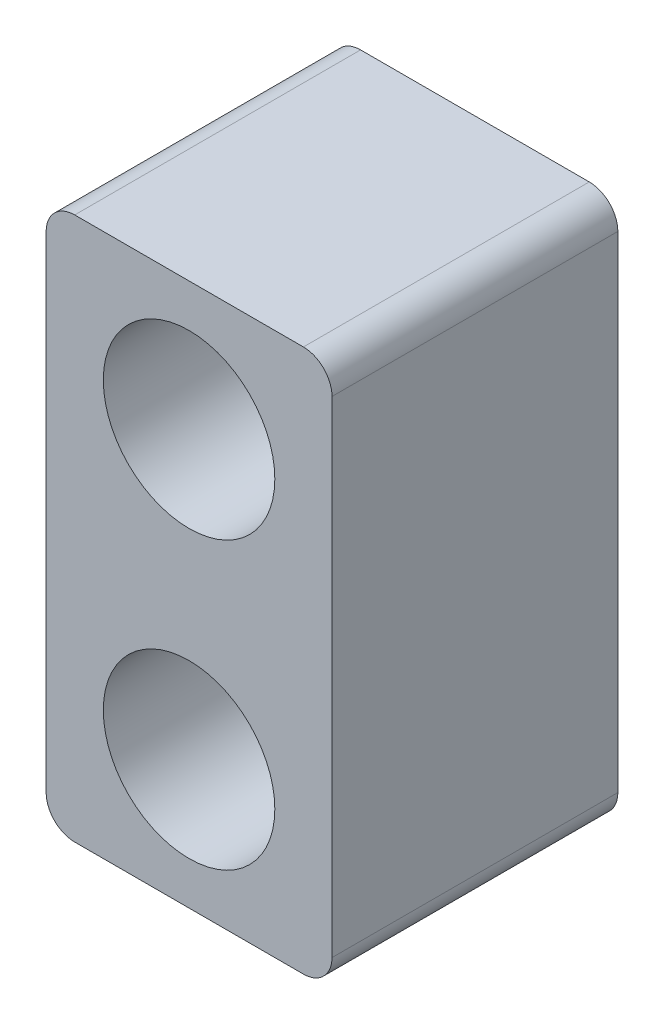
ISO-10303-21;
HEADER;
FILE_DESCRIPTION(('STEP AP214'),'2;1');
FILE_NAME('part.step','',(''),(''),'','','');
FILE_SCHEMA(('AUTOMOTIVE_DESIGN { 1 0 10303 214 1 1 1 1 }'));
ENDSEC;
DATA;
#1=APPLICATION_CONTEXT('core data for automotive mechanical design processes');
#2=APPLICATION_PROTOCOL_DEFINITION('international standard','automotive_design',2000,#1);
#3=PRODUCT_CONTEXT('',#1,'mechanical');
#4=PRODUCT('Part','Part','',(#3));
#5=PRODUCT_RELATED_PRODUCT_CATEGORY('part','',(#4));
#6=PRODUCT_DEFINITION_FORMATION('','',#4);
#7=PRODUCT_DEFINITION_CONTEXT('part definition',#1,'design');
#8=PRODUCT_DEFINITION('design','',#6,#7);
#9=PRODUCT_DEFINITION_SHAPE('','',#8);
#10=(LENGTH_UNIT() NAMED_UNIT(*) SI_UNIT(.MILLI.,.METRE.));
#11=(NAMED_UNIT(*) PLANE_ANGLE_UNIT() SI_UNIT($,.RADIAN.));
#12=(NAMED_UNIT(*) SI_UNIT($,.STERADIAN.) SOLID_ANGLE_UNIT());
#13=UNCERTAINTY_MEASURE_WITH_UNIT(LENGTH_MEASURE(1.E-05),#10,'distance_accuracy_value','');
#14=(GEOMETRIC_REPRESENTATION_CONTEXT(3) GLOBAL_UNCERTAINTY_ASSIGNED_CONTEXT((#13)) GLOBAL_UNIT_ASSIGNED_CONTEXT((#10,
#11,#12)) REPRESENTATION_CONTEXT('',''));
#15=CARTESIAN_POINT('',(0.,0.,0.));
#16=DIRECTION('',(0.,0.,1.));
#17=DIRECTION('',(1.,0.,0.));
#18=AXIS2_PLACEMENT_3D('',#15,#16,#17);
#19=CARTESIAN_POINT('',(10.,-19.,20.));
#20=DIRECTION('',(-1.,0.,0.));
#21=DIRECTION('',(0.,0.,1.));
#22=AXIS2_PLACEMENT_3D('',#19,#20,#21);
#23=PLANE('',#22);
#24=DIRECTION('',(0.,1.,0.));
#25=VECTOR('',#24,1.);
#26=CARTESIAN_POINT('',(10.,-19.,20.));
#27=LINE('',#26,#25);
#28=CARTESIAN_POINT('',(10.,-17.,20.));
#29=VERTEX_POINT('',#28);
#30=CARTESIAN_POINT('',(10.,17.,20.));
#31=VERTEX_POINT('',#30);
#32=EDGE_CURVE('E108',#29,#31,#27,.T.);
#33=ORIENTED_EDGE('',*,*,#32,.F.);
#34=DIRECTION('',(0.,0.,-1.));
#35=VECTOR('',#34,1.);
#36=CARTESIAN_POINT('',(10.,-17.,20.));
#37=LINE('',#36,#35);
#38=CARTESIAN_POINT('',(10.,-17.,0.));
#39=VERTEX_POINT('',#38);
#40=EDGE_CURVE('E151',#29,#39,#37,.T.);
#41=ORIENTED_EDGE('',*,*,#40,.T.);
#42=DIRECTION('',(0.,1.,0.));
#43=VECTOR('',#42,1.);
#44=CARTESIAN_POINT('',(10.,-19.,0.));
#45=LINE('',#44,#43);
#46=CARTESIAN_POINT('',(10.,17.,0.));
#47=VERTEX_POINT('',#46);
#48=EDGE_CURVE('E122',#39,#47,#45,.T.);
#49=ORIENTED_EDGE('',*,*,#48,.T.);
#50=DIRECTION('',(0.,0.,-1.));
#51=VECTOR('',#50,1.);
#52=CARTESIAN_POINT('',(10.,17.,20.));
#53=LINE('',#52,#51);
#54=EDGE_CURVE('E149',#47,#31,#53,.F.);
#55=ORIENTED_EDGE('',*,*,#54,.T.);
#56=EDGE_LOOP('',(#33,#41,#49,#55));
#57=FACE_BOUND('',#56,.T.);
#58=ADVANCED_FACE('F17',(#57),#23,.F.);
#59=CARTESIAN_POINT('',(-10.,19.,20.));
#60=DIRECTION('',(0.,-1.,0.));
#61=DIRECTION('',(0.,0.,-1.));
#62=AXIS2_PLACEMENT_3D('',#59,#60,#61);
#63=PLANE('',#62);
#64=DIRECTION('',(-1.,0.,0.));
#65=VECTOR('',#64,1.);
#66=CARTESIAN_POINT('',(-10.,19.,20.));
#67=LINE('',#66,#65);
#68=CARTESIAN_POINT('',(8.,19.,20.));
#69=VERTEX_POINT('',#68);
#70=CARTESIAN_POINT('',(-8.,19.,20.));
#71=VERTEX_POINT('',#70);
#72=EDGE_CURVE('E115',#69,#71,#67,.T.);
#73=ORIENTED_EDGE('',*,*,#72,.F.);
#74=DIRECTION('',(0.,0.,-1.));
#75=VECTOR('',#74,1.);
#76=CARTESIAN_POINT('',(8.,19.,20.));
#77=LINE('',#76,#75);
#78=CARTESIAN_POINT('',(8.,19.,0.));
#79=VERTEX_POINT('',#78);
#80=EDGE_CURVE('E11',#69,#79,#77,.T.);
#81=ORIENTED_EDGE('',*,*,#80,.T.);
#82=DIRECTION('',(-1.,0.,0.));
#83=VECTOR('',#82,1.);
#84=CARTESIAN_POINT('',(-10.,19.,0.));
#85=LINE('',#84,#83);
#86=CARTESIAN_POINT('',(-8.,19.,0.));
#87=VERTEX_POINT('',#86);
#88=EDGE_CURVE('E111',#79,#87,#85,.T.);
#89=ORIENTED_EDGE('',*,*,#88,.T.);
#90=DIRECTION('',(0.,0.,-1.));
#91=VECTOR('',#90,1.);
#92=CARTESIAN_POINT('',(-8.,19.,20.));
#93=LINE('',#92,#91);
#94=EDGE_CURVE('E25',#87,#71,#93,.F.);
#95=ORIENTED_EDGE('',*,*,#94,.T.);
#96=EDGE_LOOP('',(#73,#81,#89,#95));
#97=FACE_BOUND('',#96,.T.);
#98=ADVANCED_FACE('F211',(#97),#63,.F.);
#99=CARTESIAN_POINT('',(-10.,-19.,20.));
#100=DIRECTION('',(1.,0.,0.));
#101=DIRECTION('',(0.,0.,-1.));
#102=AXIS2_PLACEMENT_3D('',#99,#100,#101);
#103=PLANE('',#102);
#104=DIRECTION('',(0.,-1.,0.));
#105=VECTOR('',#104,1.);
#106=CARTESIAN_POINT('',(-10.,-19.,0.));
#107=LINE('',#106,#105);
#108=CARTESIAN_POINT('',(-10.,17.,0.));
#109=VERTEX_POINT('',#108);
#110=CARTESIAN_POINT('',(-10.,-17.,0.));
#111=VERTEX_POINT('',#110);
#112=EDGE_CURVE('E109',#109,#111,#107,.T.);
#113=ORIENTED_EDGE('',*,*,#112,.T.);
#114=DIRECTION('',(0.,0.,-1.));
#115=VECTOR('',#114,1.);
#116=CARTESIAN_POINT('',(-10.,-17.,20.));
#117=LINE('',#116,#115);
#118=CARTESIAN_POINT('',(-10.,-17.,20.));
#119=VERTEX_POINT('',#118);
#120=EDGE_CURVE('E86',#111,#119,#117,.F.);
#121=ORIENTED_EDGE('',*,*,#120,.T.);
#122=DIRECTION('',(0.,-1.,0.));
#123=VECTOR('',#122,1.);
#124=CARTESIAN_POINT('',(-10.,-19.,20.));
#125=LINE('',#124,#123);
#126=CARTESIAN_POINT('',(-10.,17.,20.));
#127=VERTEX_POINT('',#126);
#128=EDGE_CURVE('E163',#127,#119,#125,.T.);
#129=ORIENTED_EDGE('',*,*,#128,.F.);
#130=DIRECTION('',(0.,0.,-1.));
#131=VECTOR('',#130,1.);
#132=CARTESIAN_POINT('',(-10.,17.,20.));
#133=LINE('',#132,#131);
#134=EDGE_CURVE('E91',#127,#109,#133,.T.);
#135=ORIENTED_EDGE('',*,*,#134,.T.);
#136=EDGE_LOOP('',(#113,#121,#129,#135));
#137=FACE_BOUND('',#136,.T.);
#138=ADVANCED_FACE('F220',(#137),#103,.F.);
#139=CARTESIAN_POINT('',(-10.,-19.,20.));
#140=DIRECTION('',(0.,1.,0.));
#141=DIRECTION('',(0.,0.,1.));
#142=AXIS2_PLACEMENT_3D('',#139,#140,#141);
#143=PLANE('',#142);
#144=DIRECTION('',(1.,0.,0.));
#145=VECTOR('',#144,1.);
#146=CARTESIAN_POINT('',(-10.,-19.,20.));
#147=LINE('',#146,#145);
#148=CARTESIAN_POINT('',(-8.,-19.,20.));
#149=VERTEX_POINT('',#148);
#150=CARTESIAN_POINT('',(8.,-19.,20.));
#151=VERTEX_POINT('',#150);
#152=EDGE_CURVE('E103',#149,#151,#147,.T.);
#153=ORIENTED_EDGE('',*,*,#152,.F.);
#154=DIRECTION('',(0.,0.,-1.));
#155=VECTOR('',#154,1.);
#156=CARTESIAN_POINT('',(-8.,-19.,20.));
#157=LINE('',#156,#155);
#158=CARTESIAN_POINT('',(-8.,-19.,0.));
#159=VERTEX_POINT('',#158);
#160=EDGE_CURVE('E87',#149,#159,#157,.T.);
#161=ORIENTED_EDGE('',*,*,#160,.T.);
#162=DIRECTION('',(1.,0.,0.));
#163=VECTOR('',#162,1.);
#164=CARTESIAN_POINT('',(-10.,-19.,0.));
#165=LINE('',#164,#163);
#166=CARTESIAN_POINT('',(8.,-19.,0.));
#167=VERTEX_POINT('',#166);
#168=EDGE_CURVE('E99',#159,#167,#165,.T.);
#169=ORIENTED_EDGE('',*,*,#168,.T.);
#170=DIRECTION('',(0.,0.,-1.));
#171=VECTOR('',#170,1.);
#172=CARTESIAN_POINT('',(8.,-19.,20.));
#173=LINE('',#172,#171);
#174=EDGE_CURVE('E104',#167,#151,#173,.F.);
#175=ORIENTED_EDGE('',*,*,#174,.T.);
#176=EDGE_LOOP('',(#153,#161,#169,#175));
#177=FACE_BOUND('',#176,.T.);
#178=ADVANCED_FACE('F97',(#177),#143,.F.);
#179=CARTESIAN_POINT('',(0.,0.,20.));
#180=DIRECTION('',(0.,0.,-1.));
#181=DIRECTION('',(-1.,0.,0.));
#182=AXIS2_PLACEMENT_3D('',#179,#180,#181);
#183=PLANE('',#182);
#184=CARTESIAN_POINT('',(0.,-10.,20.));
#185=DIRECTION('',(0.,0.,-1.));
#186=DIRECTION('',(-1.,0.,0.));
#187=AXIS2_PLACEMENT_3D('',#184,#185,#186);
#188=CIRCLE('',#187,6.);
#189=CARTESIAN_POINT('',(-6.,-10.,20.));
#190=VERTEX_POINT('',#189);
#191=EDGE_CURVE('E172',#190,#190,#188,.T.);
#192=ORIENTED_EDGE('',*,*,#191,.T.);
#193=EDGE_LOOP('',(#192));
#194=FACE_BOUND('',#193,.T.);
#195=CARTESIAN_POINT('',(0.,10.,20.));
#196=DIRECTION('',(0.,0.,-1.));
#197=DIRECTION('',(-1.,0.,0.));
#198=AXIS2_PLACEMENT_3D('',#195,#196,#197);
#199=CIRCLE('',#198,6.);
#200=CARTESIAN_POINT('',(-6.,10.,20.));
#201=VERTEX_POINT('',#200);
#202=EDGE_CURVE('E135',#201,#201,#199,.T.);
#203=ORIENTED_EDGE('',*,*,#202,.T.);
#204=EDGE_LOOP('',(#203));
#205=FACE_BOUND('',#204,.T.);
#206=ORIENTED_EDGE('',*,*,#128,.T.);
#207=CARTESIAN_POINT('',(-8.,-17.,20.));
#208=DIRECTION('',(0.,0.,-1.));
#209=DIRECTION('',(-1.,0.,0.));
#210=AXIS2_PLACEMENT_3D('',#207,#208,#209);
#211=CIRCLE('',#210,2.);
#212=EDGE_CURVE('E150',#119,#149,#211,.F.);
#213=ORIENTED_EDGE('',*,*,#212,.T.);
#214=ORIENTED_EDGE('',*,*,#152,.T.);
#215=CARTESIAN_POINT('',(8.,-17.,20.));
#216=DIRECTION('',(0.,0.,-1.));
#217=DIRECTION('',(-1.,0.,0.));
#218=AXIS2_PLACEMENT_3D('',#215,#216,#217);
#219=CIRCLE('',#218,2.);
#220=EDGE_CURVE('E144',#151,#29,#219,.F.);
#221=ORIENTED_EDGE('',*,*,#220,.T.);
#222=ORIENTED_EDGE('',*,*,#32,.T.);
#223=CARTESIAN_POINT('',(8.,17.,20.));
#224=DIRECTION('',(0.,0.,-1.));
#225=DIRECTION('',(-1.,0.,0.));
#226=AXIS2_PLACEMENT_3D('',#223,#224,#225);
#227=CIRCLE('',#226,2.);
#228=EDGE_CURVE('E36',#31,#69,#227,.F.);
#229=ORIENTED_EDGE('',*,*,#228,.T.);
#230=ORIENTED_EDGE('',*,*,#72,.T.);
#231=CARTESIAN_POINT('',(-8.,17.,20.));
#232=DIRECTION('',(0.,0.,-1.));
#233=DIRECTION('',(-1.,0.,0.));
#234=AXIS2_PLACEMENT_3D('',#231,#232,#233);
#235=CIRCLE('',#234,2.);
#236=EDGE_CURVE('E142',#71,#127,#235,.F.);
#237=ORIENTED_EDGE('',*,*,#236,.T.);
#238=EDGE_LOOP('',(#206,#213,#214,#221,#222,#229,#230,#237));
#239=FACE_BOUND('',#238,.T.);
#240=ADVANCED_FACE('F196',(#194,#205,#239),#183,.F.);
#241=CARTESIAN_POINT('',(0.,0.,0.));
#242=DIRECTION('',(0.,0.,-1.));
#243=DIRECTION('',(-1.,0.,0.));
#244=AXIS2_PLACEMENT_3D('',#241,#242,#243);
#245=PLANE('',#244);
#246=CARTESIAN_POINT('',(0.,-10.,0.));
#247=DIRECTION('',(0.,0.,-1.));
#248=DIRECTION('',(-1.,0.,0.));
#249=AXIS2_PLACEMENT_3D('',#246,#247,#248);
#250=CIRCLE('',#249,2.1);
#251=CARTESIAN_POINT('',(-2.1,-10.,0.));
#252=VERTEX_POINT('',#251);
#253=EDGE_CURVE('E125',#252,#252,#250,.T.);
#254=ORIENTED_EDGE('',*,*,#253,.F.);
#255=EDGE_LOOP('',(#254));
#256=FACE_BOUND('',#255,.T.);
#257=CARTESIAN_POINT('',(0.,10.,0.));
#258=DIRECTION('',(0.,0.,-1.));
#259=DIRECTION('',(-1.,0.,0.));
#260=AXIS2_PLACEMENT_3D('',#257,#258,#259);
#261=CIRCLE('',#260,2.1);
#262=CARTESIAN_POINT('',(-2.1,10.,0.));
#263=VERTEX_POINT('',#262);
#264=EDGE_CURVE('E119',#263,#263,#261,.T.);
#265=ORIENTED_EDGE('',*,*,#264,.F.);
#266=EDGE_LOOP('',(#265));
#267=FACE_BOUND('',#266,.T.);
#268=ORIENTED_EDGE('',*,*,#168,.F.);
#269=CARTESIAN_POINT('',(-8.,-17.,0.));
#270=DIRECTION('',(0.,0.,-1.));
#271=DIRECTION('',(-1.,0.,0.));
#272=AXIS2_PLACEMENT_3D('',#269,#270,#271);
#273=CIRCLE('',#272,2.);
#274=EDGE_CURVE('E83',#159,#111,#273,.T.);
#275=ORIENTED_EDGE('',*,*,#274,.T.);
#276=ORIENTED_EDGE('',*,*,#112,.F.);
#277=CARTESIAN_POINT('',(-8.,17.,0.));
#278=DIRECTION('',(0.,0.,-1.));
#279=DIRECTION('',(-1.,0.,0.));
#280=AXIS2_PLACEMENT_3D('',#277,#278,#279);
#281=CIRCLE('',#280,2.);
#282=EDGE_CURVE('E102',#109,#87,#281,.T.);
#283=ORIENTED_EDGE('',*,*,#282,.T.);
#284=ORIENTED_EDGE('',*,*,#88,.F.);
#285=CARTESIAN_POINT('',(8.,17.,0.));
#286=DIRECTION('',(0.,0.,-1.));
#287=DIRECTION('',(-1.,0.,0.));
#288=AXIS2_PLACEMENT_3D('',#285,#286,#287);
#289=CIRCLE('',#288,2.);
#290=EDGE_CURVE('E136',#79,#47,#289,.T.);
#291=ORIENTED_EDGE('',*,*,#290,.T.);
#292=ORIENTED_EDGE('',*,*,#48,.F.);
#293=CARTESIAN_POINT('',(8.,-17.,0.));
#294=DIRECTION('',(0.,0.,-1.));
#295=DIRECTION('',(-1.,0.,0.));
#296=AXIS2_PLACEMENT_3D('',#293,#294,#295);
#297=CIRCLE('',#296,2.);
#298=EDGE_CURVE('E94',#39,#167,#297,.T.);
#299=ORIENTED_EDGE('',*,*,#298,.T.);
#300=EDGE_LOOP('',(#268,#275,#276,#283,#284,#291,#292,#299));
#301=FACE_BOUND('',#300,.T.);
#302=ADVANCED_FACE('F110',(#256,#267,#301),#245,.T.);
#303=CARTESIAN_POINT('',(0.,10.,20.));
#304=DIRECTION('',(0.,0.,-1.));
#305=DIRECTION('',(-1.,0.,0.));
#306=AXIS2_PLACEMENT_3D('',#303,#304,#305);
#307=CYLINDRICAL_SURFACE('',#306,2.1);
#308=CARTESIAN_POINT('',(0.,10.,10.));
#309=DIRECTION('',(0.,0.,-1.));
#310=DIRECTION('',(-1.,0.,0.));
#311=AXIS2_PLACEMENT_3D('',#308,#309,#310);
#312=CIRCLE('',#311,2.1);
#313=CARTESIAN_POINT('',(-2.1,10.,10.));
#314=VERTEX_POINT('',#313);
#315=EDGE_CURVE('E123',#314,#314,#312,.F.);
#316=ORIENTED_EDGE('',*,*,#315,.T.);
#317=EDGE_LOOP('',(#316));
#318=FACE_BOUND('',#317,.T.);
#319=ORIENTED_EDGE('',*,*,#264,.T.);
#320=EDGE_LOOP('',(#319));
#321=FACE_BOUND('',#320,.T.);
#322=ADVANCED_FACE('F195',(#318,#321),#307,.F.);
#323=CARTESIAN_POINT('',(0.,-10.,20.));
#324=DIRECTION('',(0.,0.,-1.));
#325=DIRECTION('',(-1.,0.,0.));
#326=AXIS2_PLACEMENT_3D('',#323,#324,#325);
#327=CYLINDRICAL_SURFACE('',#326,2.1);
#328=CARTESIAN_POINT('',(0.,-10.,10.));
#329=DIRECTION('',(0.,0.,-1.));
#330=DIRECTION('',(-1.,0.,0.));
#331=AXIS2_PLACEMENT_3D('',#328,#329,#330);
#332=CIRCLE('',#331,2.1);
#333=CARTESIAN_POINT('',(-2.1,-10.,10.));
#334=VERTEX_POINT('',#333);
#335=EDGE_CURVE('E127',#334,#334,#332,.F.);
#336=ORIENTED_EDGE('',*,*,#335,.T.);
#337=EDGE_LOOP('',(#336));
#338=FACE_BOUND('',#337,.T.);
#339=ORIENTED_EDGE('',*,*,#253,.T.);
#340=EDGE_LOOP('',(#339));
#341=FACE_BOUND('',#340,.T.);
#342=ADVANCED_FACE('F187',(#338,#341),#327,.F.);
#343=CARTESIAN_POINT('',(0.,10.,10.));
#344=DIRECTION('',(0.,0.,-1.));
#345=DIRECTION('',(-1.,0.,0.));
#346=AXIS2_PLACEMENT_3D('',#343,#344,#345);
#347=PLANE('',#346);
#348=CARTESIAN_POINT('',(0.,10.,10.));
#349=DIRECTION('',(0.,0.,-1.));
#350=DIRECTION('',(-1.,0.,0.));
#351=AXIS2_PLACEMENT_3D('',#348,#349,#350);
#352=CIRCLE('',#351,6.);
#353=CARTESIAN_POINT('',(-6.,10.,10.));
#354=VERTEX_POINT('',#353);
#355=EDGE_CURVE('E128',#354,#354,#352,.T.);
#356=ORIENTED_EDGE('',*,*,#355,.F.);
#357=EDGE_LOOP('',(#356));
#358=FACE_BOUND('',#357,.T.);
#359=ORIENTED_EDGE('',*,*,#315,.F.);
#360=EDGE_LOOP('',(#359));
#361=FACE_BOUND('',#360,.T.);
#362=ADVANCED_FACE('F191',(#358,#361),#347,.F.);
#363=CARTESIAN_POINT('',(0.,10.,10.));
#364=DIRECTION('',(0.,0.,1.));
#365=DIRECTION('',(1.,0.,0.));
#366=AXIS2_PLACEMENT_3D('',#363,#364,#365);
#367=CYLINDRICAL_SURFACE('',#366,6.);
#368=ORIENTED_EDGE('',*,*,#355,.T.);
#369=EDGE_LOOP('',(#368));
#370=FACE_BOUND('',#369,.T.);
#371=ORIENTED_EDGE('',*,*,#202,.F.);
#372=EDGE_LOOP('',(#371));
#373=FACE_BOUND('',#372,.T.);
#374=ADVANCED_FACE('F182',(#370,#373),#367,.F.);
#375=CARTESIAN_POINT('',(0.,-10.,10.));
#376=DIRECTION('',(0.,0.,-1.));
#377=DIRECTION('',(-1.,0.,0.));
#378=AXIS2_PLACEMENT_3D('',#375,#376,#377);
#379=PLANE('',#378);
#380=CARTESIAN_POINT('',(0.,-10.,10.));
#381=DIRECTION('',(0.,0.,-1.));
#382=DIRECTION('',(-1.,0.,0.));
#383=AXIS2_PLACEMENT_3D('',#380,#381,#382);
#384=CIRCLE('',#383,6.);
#385=CARTESIAN_POINT('',(-6.,-10.,10.));
#386=VERTEX_POINT('',#385);
#387=EDGE_CURVE('E132',#386,#386,#384,.T.);
#388=ORIENTED_EDGE('',*,*,#387,.F.);
#389=EDGE_LOOP('',(#388));
#390=FACE_BOUND('',#389,.T.);
#391=ORIENTED_EDGE('',*,*,#335,.F.);
#392=EDGE_LOOP('',(#391));
#393=FACE_BOUND('',#392,.T.);
#394=ADVANCED_FACE('F185',(#390,#393),#379,.F.);
#395=CARTESIAN_POINT('',(0.,-10.,10.));
#396=DIRECTION('',(0.,0.,1.));
#397=DIRECTION('',(1.,0.,0.));
#398=AXIS2_PLACEMENT_3D('',#395,#396,#397);
#399=CYLINDRICAL_SURFACE('',#398,6.);
#400=ORIENTED_EDGE('',*,*,#387,.T.);
#401=EDGE_LOOP('',(#400));
#402=FACE_BOUND('',#401,.T.);
#403=ORIENTED_EDGE('',*,*,#191,.F.);
#404=EDGE_LOOP('',(#403));
#405=FACE_BOUND('',#404,.T.);
#406=ADVANCED_FACE('F179',(#402,#405),#399,.F.);
#407=CARTESIAN_POINT('',(-8.,-17.,20.));
#408=DIRECTION('',(0.,0.,-1.));
#409=DIRECTION('',(-1.,0.,0.));
#410=AXIS2_PLACEMENT_3D('',#407,#408,#409);
#411=CYLINDRICAL_SURFACE('',#410,2.);
#412=ORIENTED_EDGE('',*,*,#212,.F.);
#413=ORIENTED_EDGE('',*,*,#120,.F.);
#414=ORIENTED_EDGE('',*,*,#274,.F.);
#415=ORIENTED_EDGE('',*,*,#160,.F.);
#416=EDGE_LOOP('',(#412,#413,#414,#415));
#417=FACE_BOUND('',#416,.T.);
#418=ADVANCED_FACE('F88',(#417),#411,.T.);
#419=CARTESIAN_POINT('',(8.,-17.,20.));
#420=DIRECTION('',(0.,0.,-1.));
#421=DIRECTION('',(-1.,0.,0.));
#422=AXIS2_PLACEMENT_3D('',#419,#420,#421);
#423=CYLINDRICAL_SURFACE('',#422,2.);
#424=ORIENTED_EDGE('',*,*,#220,.F.);
#425=ORIENTED_EDGE('',*,*,#174,.F.);
#426=ORIENTED_EDGE('',*,*,#298,.F.);
#427=ORIENTED_EDGE('',*,*,#40,.F.);
#428=EDGE_LOOP('',(#424,#425,#426,#427));
#429=FACE_BOUND('',#428,.T.);
#430=ADVANCED_FACE('F224',(#429),#423,.T.);
#431=CARTESIAN_POINT('',(8.,17.,20.));
#432=DIRECTION('',(0.,0.,-1.));
#433=DIRECTION('',(-1.,0.,0.));
#434=AXIS2_PLACEMENT_3D('',#431,#432,#433);
#435=CYLINDRICAL_SURFACE('',#434,2.);
#436=ORIENTED_EDGE('',*,*,#228,.F.);
#437=ORIENTED_EDGE('',*,*,#54,.F.);
#438=ORIENTED_EDGE('',*,*,#290,.F.);
#439=ORIENTED_EDGE('',*,*,#80,.F.);
#440=EDGE_LOOP('',(#436,#437,#438,#439));
#441=FACE_BOUND('',#440,.T.);
#442=ADVANCED_FACE('F223',(#441),#435,.T.);
#443=CARTESIAN_POINT('',(-8.,17.,20.));
#444=DIRECTION('',(0.,0.,-1.));
#445=DIRECTION('',(-1.,0.,0.));
#446=AXIS2_PLACEMENT_3D('',#443,#444,#445);
#447=CYLINDRICAL_SURFACE('',#446,2.);
#448=ORIENTED_EDGE('',*,*,#236,.F.);
#449=ORIENTED_EDGE('',*,*,#94,.F.);
#450=ORIENTED_EDGE('',*,*,#282,.F.);
#451=ORIENTED_EDGE('',*,*,#134,.F.);
#452=EDGE_LOOP('',(#448,#449,#450,#451));
#453=FACE_BOUND('',#452,.T.);
#454=ADVANCED_FACE('F19',(#453),#447,.T.);
#455=CLOSED_SHELL('',(#58,#98,#138,#178,#240,#302,#322,#342,#362,#374,#394,#406,#418,#430,#442,#454));
#456=MANIFOLD_SOLID_BREP('B1',#455);
#457=ADVANCED_BREP_SHAPE_REPRESENTATION('',(#18,#456),#14);
#458=SHAPE_DEFINITION_REPRESENTATION(#9,#457);
ENDSEC;
END-ISO-10303-21;
